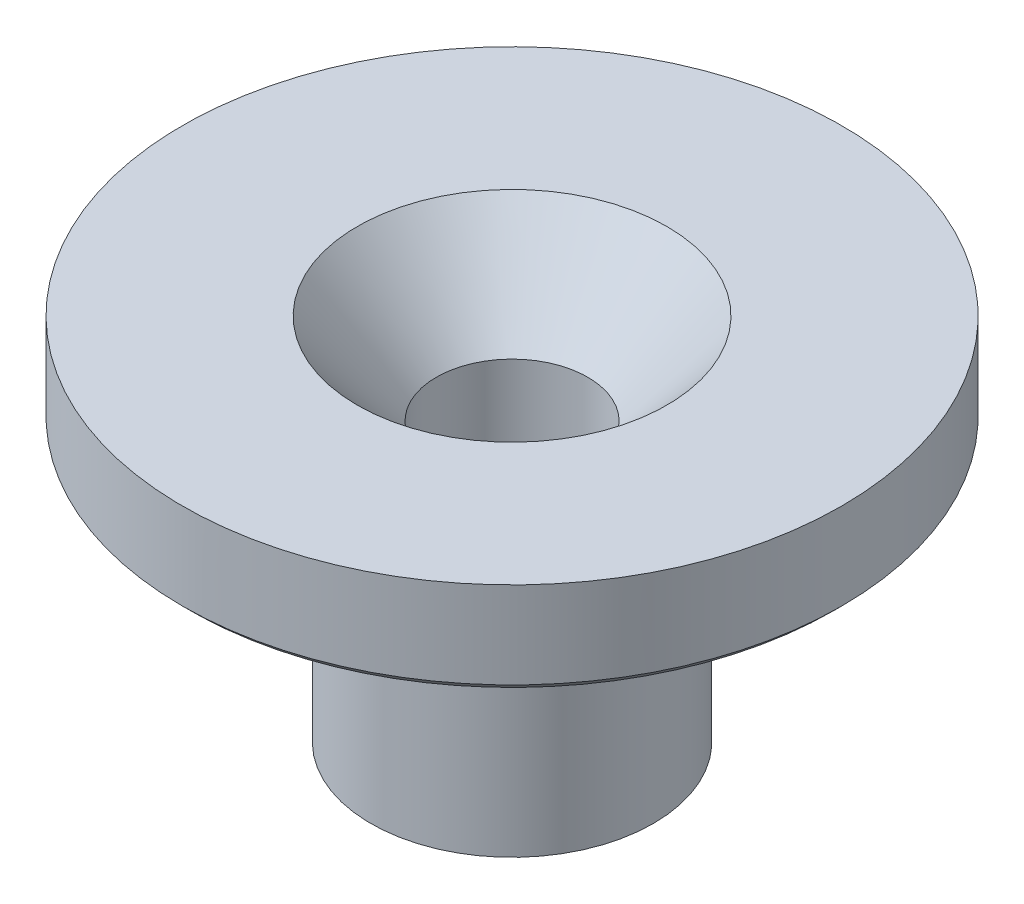
ISO-10303-21;
HEADER;
FILE_DESCRIPTION(('STEP AP214'),'2;1');
FILE_NAME('part.step','',(''),(''),'','','');
FILE_SCHEMA(('AUTOMOTIVE_DESIGN { 1 0 10303 214 1 1 1 1 }'));
ENDSEC;
DATA;
#1=APPLICATION_CONTEXT('core data for automotive mechanical design processes');
#2=APPLICATION_PROTOCOL_DEFINITION('international standard','automotive_design',2000,#1);
#3=PRODUCT_CONTEXT('',#1,'mechanical');
#4=PRODUCT('Part','Part','',(#3));
#5=PRODUCT_RELATED_PRODUCT_CATEGORY('part','',(#4));
#6=PRODUCT_DEFINITION_FORMATION('','',#4);
#7=PRODUCT_DEFINITION_CONTEXT('part definition',#1,'design');
#8=PRODUCT_DEFINITION('design','',#6,#7);
#9=PRODUCT_DEFINITION_SHAPE('','',#8);
#10=(LENGTH_UNIT() NAMED_UNIT(*) SI_UNIT(.MILLI.,.METRE.));
#11=(NAMED_UNIT(*) PLANE_ANGLE_UNIT() SI_UNIT($,.RADIAN.));
#12=(NAMED_UNIT(*) SI_UNIT($,.STERADIAN.) SOLID_ANGLE_UNIT());
#13=UNCERTAINTY_MEASURE_WITH_UNIT(LENGTH_MEASURE(1.E-05),#10,'distance_accuracy_value','');
#14=(GEOMETRIC_REPRESENTATION_CONTEXT(3) GLOBAL_UNCERTAINTY_ASSIGNED_CONTEXT((#13)) GLOBAL_UNIT_ASSIGNED_CONTEXT((#10,
#11,#12)) REPRESENTATION_CONTEXT('',''));
#15=CARTESIAN_POINT('',(0.,0.,0.));
#16=DIRECTION('',(0.,0.,1.));
#17=DIRECTION('',(1.,0.,0.));
#18=AXIS2_PLACEMENT_3D('',#15,#16,#17);
#19=CARTESIAN_POINT('',(0.,10.1404936145992,0.));
#20=DIRECTION('',(0.,-1.,0.));
#21=DIRECTION('',(1.,0.,0.));
#22=AXIS2_PLACEMENT_3D('',#19,#20,#21);
#23=PLANE('',#22);
#24=CARTESIAN_POINT('',(0.,10.1404936145992,0.));
#25=DIRECTION('',(0.,1.,0.));
#26=DIRECTION('',(0.,0.,1.));
#27=AXIS2_PLACEMENT_3D('',#24,#25,#26);
#28=CIRCLE('',#27,5.2197);
#29=CARTESIAN_POINT('',(0.,10.1404936145992,5.2197));
#30=VERTEX_POINT('',#29);
#31=EDGE_CURVE('E59',#30,#30,#28,.T.);
#32=ORIENTED_EDGE('',*,*,#31,.F.);
#33=EDGE_LOOP('',(#32));
#34=FACE_BOUND('',#33,.T.);
#35=CARTESIAN_POINT('',(0.,10.1404936145992,0.));
#36=DIRECTION('',(0.,-1.,0.));
#37=DIRECTION('',(1.,0.,0.));
#38=AXIS2_PLACEMENT_3D('',#35,#36,#37);
#39=CIRCLE('',#38,11.1125);
#40=CARTESIAN_POINT('',(11.1125,10.1404936145992,0.));
#41=VERTEX_POINT('',#40);
#42=EDGE_CURVE('E41',#41,#41,#39,.T.);
#43=ORIENTED_EDGE('',*,*,#42,.F.);
#44=EDGE_LOOP('',(#43));
#45=FACE_BOUND('',#44,.T.);
#46=ADVANCED_FACE('F30',(#34,#45),#23,.F.);
#47=CARTESIAN_POINT('',(0.,-2.30550638540078,0.));
#48=DIRECTION('',(0.,-1.,0.));
#49=DIRECTION('',(1.,0.,0.));
#50=AXIS2_PLACEMENT_3D('',#47,#48,#49);
#51=CYLINDRICAL_SURFACE('',#50,11.1125);
#52=CARTESIAN_POINT('',(0.,7.21949361459922,0.));
#53=DIRECTION('',(0.,1.,0.));
#54=DIRECTION('',(-1.,0.,0.));
#55=AXIS2_PLACEMENT_3D('',#52,#53,#54);
#56=CIRCLE('',#55,11.1125);
#57=CARTESIAN_POINT('',(-11.1125,7.21949361459922,0.));
#58=VERTEX_POINT('',#57);
#59=EDGE_CURVE('E10',#58,#58,#56,.T.);
#60=ORIENTED_EDGE('',*,*,#59,.T.);
#61=EDGE_LOOP('',(#60));
#62=FACE_BOUND('',#61,.T.);
#63=ORIENTED_EDGE('',*,*,#42,.T.);
#64=EDGE_LOOP('',(#63));
#65=FACE_BOUND('',#64,.T.);
#66=ADVANCED_FACE('F67',(#62,#65),#51,.T.);
#67=CARTESIAN_POINT('',(-11.1125,6.96549361459922,0.));
#68=DIRECTION('',(0.,1.,0.));
#69=DIRECTION('',(-1.,0.,0.));
#70=AXIS2_PLACEMENT_3D('',#67,#68,#69);
#71=PLANE('',#70);
#72=CARTESIAN_POINT('',(0.,6.96549361459922,0.));
#73=DIRECTION('',(0.,1.,0.));
#74=DIRECTION('',(-1.,0.,0.));
#75=AXIS2_PLACEMENT_3D('',#72,#73,#74);
#76=CIRCLE('',#75,10.8585);
#77=CARTESIAN_POINT('',(-10.8585,6.96549361459922,0.));
#78=VERTEX_POINT('',#77);
#79=EDGE_CURVE('E37',#78,#78,#76,.F.);
#80=ORIENTED_EDGE('',*,*,#79,.T.);
#81=EDGE_LOOP('',(#80));
#82=FACE_BOUND('',#81,.T.);
#83=CARTESIAN_POINT('',(0.,6.96549361459923,0.));
#84=DIRECTION('',(0.,-1.,0.));
#85=DIRECTION('',(1.,0.,0.));
#86=AXIS2_PLACEMENT_3D('',#83,#84,#85);
#87=CIRCLE('',#86,4.7625);
#88=CARTESIAN_POINT('',(4.7625,6.96549361459923,0.));
#89=VERTEX_POINT('',#88);
#90=EDGE_CURVE('E45',#89,#89,#87,.T.);
#91=ORIENTED_EDGE('',*,*,#90,.F.);
#92=EDGE_LOOP('',(#91));
#93=FACE_BOUND('',#92,.T.);
#94=ADVANCED_FACE('F71',(#82,#93),#71,.F.);
#95=CARTESIAN_POINT('',(0.,-2.30550638540078,0.));
#96=DIRECTION('',(0.,-1.,0.));
#97=DIRECTION('',(1.,0.,0.));
#98=AXIS2_PLACEMENT_3D('',#95,#96,#97);
#99=CYLINDRICAL_SURFACE('',#98,4.7625);
#100=CARTESIAN_POINT('',(0.,-2.30550638540078,0.));
#101=DIRECTION('',(0.,-1.,0.));
#102=DIRECTION('',(1.,0.,0.));
#103=AXIS2_PLACEMENT_3D('',#100,#101,#102);
#104=CIRCLE('',#103,4.7625);
#105=CARTESIAN_POINT('',(4.7625,-2.30550638540078,0.));
#106=VERTEX_POINT('',#105);
#107=EDGE_CURVE('E50',#106,#106,#104,.T.);
#108=ORIENTED_EDGE('',*,*,#107,.F.);
#109=EDGE_LOOP('',(#108));
#110=FACE_BOUND('',#109,.T.);
#111=ORIENTED_EDGE('',*,*,#90,.T.);
#112=EDGE_LOOP('',(#111));
#113=FACE_BOUND('',#112,.T.);
#114=ADVANCED_FACE('F76',(#110,#113),#99,.T.);
#115=CARTESIAN_POINT('',(-4.7625,-2.30550638540078,0.));
#116=DIRECTION('',(0.,1.,0.));
#117=DIRECTION('',(-1.,0.,0.));
#118=AXIS2_PLACEMENT_3D('',#115,#116,#117);
#119=PLANE('',#118);
#120=CARTESIAN_POINT('',(0.,-2.30550638540078,0.));
#121=DIRECTION('',(0.,1.,0.));
#122=DIRECTION('',(0.,0.,1.));
#123=AXIS2_PLACEMENT_3D('',#120,#121,#122);
#124=CIRCLE('',#123,2.5527);
#125=CARTESIAN_POINT('',(0.,-2.30550638540078,2.5527));
#126=VERTEX_POINT('',#125);
#127=EDGE_CURVE('E53',#126,#126,#124,.T.);
#128=ORIENTED_EDGE('',*,*,#127,.T.);
#129=EDGE_LOOP('',(#128));
#130=FACE_BOUND('',#129,.T.);
#131=ORIENTED_EDGE('',*,*,#107,.T.);
#132=EDGE_LOOP('',(#131));
#133=FACE_BOUND('',#132,.T.);
#134=ADVANCED_FACE('F81',(#130,#133),#119,.F.);
#135=CARTESIAN_POINT('',(0.,10.1404936145992,0.));
#136=DIRECTION('',(0.,1.,0.));
#137=DIRECTION('',(0.,0.,1.));
#138=AXIS2_PLACEMENT_3D('',#135,#136,#137);
#139=CYLINDRICAL_SURFACE('',#138,2.5527);
#140=ORIENTED_EDGE('',*,*,#127,.F.);
#141=EDGE_LOOP('',(#140));
#142=FACE_BOUND('',#141,.T.);
#143=CARTESIAN_POINT('',(0.,7.07246107254078,0.));
#144=DIRECTION('',(0.,1.,0.));
#145=DIRECTION('',(0.,0.,1.));
#146=AXIS2_PLACEMENT_3D('',#143,#144,#145);
#147=CIRCLE('',#146,2.5527);
#148=CARTESIAN_POINT('',(0.,7.07246107254078,2.5527));
#149=VERTEX_POINT('',#148);
#150=EDGE_CURVE('E56',#149,#149,#147,.T.);
#151=ORIENTED_EDGE('',*,*,#150,.T.);
#152=EDGE_LOOP('',(#151));
#153=FACE_BOUND('',#152,.T.);
#154=ADVANCED_FACE('F85',(#142,#153),#139,.F.);
#155=CARTESIAN_POINT('',(0.,10.1404936145992,0.));
#156=DIRECTION('',(0.,1.,0.));
#157=DIRECTION('',(0.,0.,1.));
#158=AXIS2_PLACEMENT_3D('',#155,#156,#157);
#159=CONICAL_SURFACE('',#158,5.2197,0.715584993317675);
#160=ORIENTED_EDGE('',*,*,#150,.F.);
#161=EDGE_LOOP('',(#160));
#162=FACE_BOUND('',#161,.T.);
#163=ORIENTED_EDGE('',*,*,#31,.T.);
#164=EDGE_LOOP('',(#163));
#165=FACE_BOUND('',#164,.T.);
#166=ADVANCED_FACE('F63',(#162,#165),#159,.F.);
#167=CARTESIAN_POINT('',(0.,6.96549361459922,0.));
#168=DIRECTION('',(0.,1.,0.));
#169=DIRECTION('',(-1.,0.,0.));
#170=AXIS2_PLACEMENT_3D('',#167,#168,#169);
#171=CONICAL_SURFACE('',#170,10.8585,0.785398163397452);
#172=ORIENTED_EDGE('',*,*,#59,.F.);
#173=EDGE_LOOP('',(#172));
#174=FACE_BOUND('',#173,.T.);
#175=ORIENTED_EDGE('',*,*,#79,.F.);
#176=EDGE_LOOP('',(#175));
#177=FACE_BOUND('',#176,.T.);
#178=ADVANCED_FACE('F32',(#174,#177),#171,.T.);
#179=CLOSED_SHELL('',(#46,#66,#94,#114,#134,#154,#166,#178));
#180=MANIFOLD_SOLID_BREP('B2',#179);
#181=ADVANCED_BREP_SHAPE_REPRESENTATION('',(#18,#180),#14);
#182=SHAPE_DEFINITION_REPRESENTATION(#9,#181);
ENDSEC;
END-ISO-10303-21;
